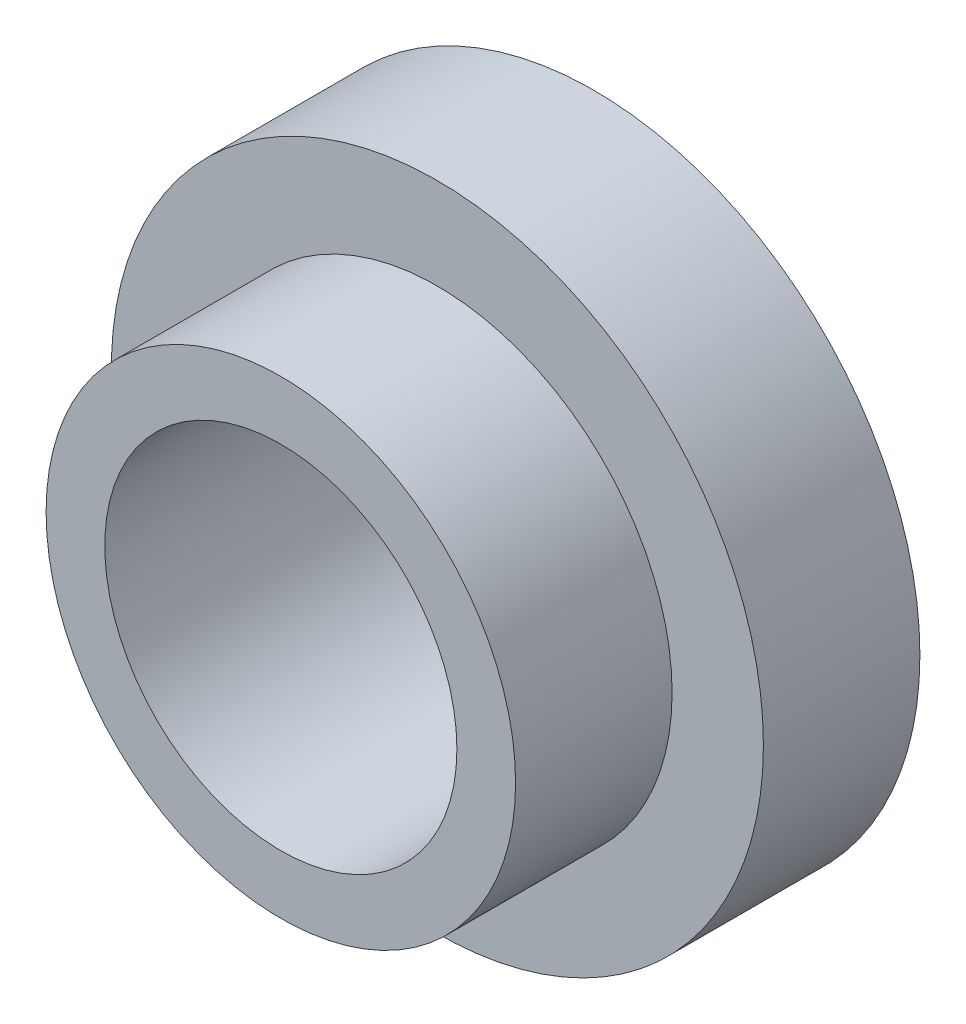
ISO-10303-21;
HEADER;
FILE_DESCRIPTION(('STEP AP214'),'2;1');
FILE_NAME('part.step','',(''),(''),'','','');
FILE_SCHEMA(('AUTOMOTIVE_DESIGN { 1 0 10303 214 1 1 1 1 }'));
ENDSEC;
DATA;
#1=APPLICATION_CONTEXT('core data for automotive mechanical design processes');
#2=APPLICATION_PROTOCOL_DEFINITION('international standard','automotive_design',2000,#1);
#3=PRODUCT_CONTEXT('',#1,'mechanical');
#4=PRODUCT('Part','Part','',(#3));
#5=PRODUCT_RELATED_PRODUCT_CATEGORY('part','',(#4));
#6=PRODUCT_DEFINITION_FORMATION('','',#4);
#7=PRODUCT_DEFINITION_CONTEXT('part definition',#1,'design');
#8=PRODUCT_DEFINITION('design','',#6,#7);
#9=PRODUCT_DEFINITION_SHAPE('','',#8);
#10=(LENGTH_UNIT() NAMED_UNIT(*) SI_UNIT(.MILLI.,.METRE.));
#11=(NAMED_UNIT(*) PLANE_ANGLE_UNIT() SI_UNIT($,.RADIAN.));
#12=(NAMED_UNIT(*) SI_UNIT($,.STERADIAN.) SOLID_ANGLE_UNIT());
#13=UNCERTAINTY_MEASURE_WITH_UNIT(LENGTH_MEASURE(1.E-05),#10,'distance_accuracy_value','');
#14=(GEOMETRIC_REPRESENTATION_CONTEXT(3) GLOBAL_UNCERTAINTY_ASSIGNED_CONTEXT((#13)) GLOBAL_UNIT_ASSIGNED_CONTEXT((#10,
#11,#12)) REPRESENTATION_CONTEXT('',''));
#15=CARTESIAN_POINT('',(0.,0.,0.));
#16=DIRECTION('',(0.,0.,1.));
#17=DIRECTION('',(1.,0.,0.));
#18=AXIS2_PLACEMENT_3D('',#15,#16,#17);
#19=CARTESIAN_POINT('',(0.,0.,4.));
#20=DIRECTION('',(0.,0.,1.));
#21=DIRECTION('',(1.,0.,0.));
#22=AXIS2_PLACEMENT_3D('',#19,#20,#21);
#23=PLANE('',#22);
#24=CARTESIAN_POINT('',(-9.52627944162862,5.49999999999963,4.));
#25=DIRECTION('',(0.,0.,1.));
#26=DIRECTION('',(1.,0.,0.));
#27=AXIS2_PLACEMENT_3D('',#24,#25,#26);
#28=CIRCLE('',#27,1.55);
#29=CARTESIAN_POINT('',(-7.97627944162862,5.49999999999963,4.));
#30=VERTEX_POINT('',#29);
#31=EDGE_CURVE('E83',#30,#30,#28,.T.);
#32=ORIENTED_EDGE('',*,*,#31,.F.);
#33=EDGE_LOOP('',(#32));
#34=FACE_BOUND('',#33,.T.);
#35=CARTESIAN_POINT('',(8.35628580991773E-13,-11.,4.));
#36=DIRECTION('',(0.,0.,1.));
#37=DIRECTION('',(1.,0.,0.));
#38=AXIS2_PLACEMENT_3D('',#35,#36,#37);
#39=CIRCLE('',#38,1.55);
#40=CARTESIAN_POINT('',(1.55000000000084,-11.,4.));
#41=VERTEX_POINT('',#40);
#42=EDGE_CURVE('E94',#41,#41,#39,.T.);
#43=ORIENTED_EDGE('',*,*,#42,.F.);
#44=EDGE_LOOP('',(#43));
#45=FACE_BOUND('',#44,.T.);
#46=CARTESIAN_POINT('',(9.52627944162903,5.50000000000037,4.));
#47=DIRECTION('',(0.,0.,1.));
#48=DIRECTION('',(1.,0.,0.));
#49=AXIS2_PLACEMENT_3D('',#46,#47,#48);
#50=CIRCLE('',#49,1.55);
#51=CARTESIAN_POINT('',(11.076279441629,5.50000000000037,4.));
#52=VERTEX_POINT('',#51);
#53=EDGE_CURVE('E107',#52,#52,#50,.T.);
#54=ORIENTED_EDGE('',*,*,#53,.F.);
#55=EDGE_LOOP('',(#54));
#56=FACE_BOUND('',#55,.T.);
#57=CARTESIAN_POINT('',(0.,0.,4.));
#58=DIRECTION('',(0.,0.,1.));
#59=DIRECTION('',(1.,0.,0.));
#60=AXIS2_PLACEMENT_3D('',#57,#58,#59);
#61=CIRCLE('',#60,5.5);
#62=CARTESIAN_POINT('',(5.5,0.,4.));
#63=VERTEX_POINT('',#62);
#64=EDGE_CURVE('E50',#63,#63,#61,.T.);
#65=ORIENTED_EDGE('',*,*,#64,.F.);
#66=EDGE_LOOP('',(#65));
#67=FACE_BOUND('',#66,.T.);
#68=CARTESIAN_POINT('',(0.,11.,4.));
#69=DIRECTION('',(0.,0.,1.));
#70=DIRECTION('',(1.,0.,0.));
#71=AXIS2_PLACEMENT_3D('',#68,#69,#70);
#72=CIRCLE('',#71,1.55);
#73=CARTESIAN_POINT('',(1.55,11.,4.));
#74=VERTEX_POINT('',#73);
#75=EDGE_CURVE('E111',#74,#74,#72,.T.);
#76=ORIENTED_EDGE('',*,*,#75,.F.);
#77=EDGE_LOOP('',(#76));
#78=FACE_BOUND('',#77,.T.);
#79=CARTESIAN_POINT('',(9.52627944162945,-5.49999999999964,4.));
#80=DIRECTION('',(0.,0.,1.));
#81=DIRECTION('',(1.,0.,0.));
#82=AXIS2_PLACEMENT_3D('',#79,#80,#81);
#83=CIRCLE('',#82,1.55);
#84=CARTESIAN_POINT('',(11.0762794416295,-5.49999999999964,4.));
#85=VERTEX_POINT('',#84);
#86=EDGE_CURVE('E103',#85,#85,#83,.T.);
#87=ORIENTED_EDGE('',*,*,#86,.F.);
#88=EDGE_LOOP('',(#87));
#89=FACE_BOUND('',#88,.T.);
#90=CARTESIAN_POINT('',(-9.5262794416282,-5.50000000000037,4.));
#91=DIRECTION('',(0.,0.,1.));
#92=DIRECTION('',(1.,0.,0.));
#93=AXIS2_PLACEMENT_3D('',#90,#91,#92);
#94=CIRCLE('',#93,1.55);
#95=CARTESIAN_POINT('',(-7.9762794416282,-5.50000000000037,4.));
#96=VERTEX_POINT('',#95);
#97=EDGE_CURVE('E88',#96,#96,#94,.T.);
#98=ORIENTED_EDGE('',*,*,#97,.F.);
#99=EDGE_LOOP('',(#98));
#100=FACE_BOUND('',#99,.T.);
#101=CARTESIAN_POINT('',(0.,0.,4.));
#102=DIRECTION('',(0.,0.,1.));
#103=DIRECTION('',(1.,0.,0.));
#104=AXIS2_PLACEMENT_3D('',#101,#102,#103);
#105=CIRCLE('',#104,13.5);
#106=CARTESIAN_POINT('',(13.5,0.,4.));
#107=VERTEX_POINT('',#106);
#108=EDGE_CURVE('E10',#107,#107,#105,.F.);
#109=ORIENTED_EDGE('',*,*,#108,.F.);
#110=EDGE_LOOP('',(#109));
#111=FACE_BOUND('',#110,.T.);
#112=ADVANCED_FACE('F37',(#34,#45,#56,#67,#78,#89,#100,#111),#23,.T.);
#113=CARTESIAN_POINT('',(0.,11.,4.));
#114=DIRECTION('',(0.,0.,-1.));
#115=DIRECTION('',(-1.,0.,0.));
#116=AXIS2_PLACEMENT_3D('',#113,#114,#115);
#117=CYLINDRICAL_SURFACE('',#116,1.55);
#118=ORIENTED_EDGE('',*,*,#75,.T.);
#119=EDGE_LOOP('',(#118));
#120=FACE_BOUND('',#119,.T.);
#121=CARTESIAN_POINT('',(0.,11.,2.8));
#122=DIRECTION('',(0.,0.,-1.));
#123=DIRECTION('',(-1.,0.,0.));
#124=AXIS2_PLACEMENT_3D('',#121,#122,#123);
#125=CIRCLE('',#124,1.55);
#126=CARTESIAN_POINT('',(-1.55,11.,2.8));
#127=VERTEX_POINT('',#126);
#128=EDGE_CURVE('E80',#127,#127,#125,.T.);
#129=ORIENTED_EDGE('',*,*,#128,.T.);
#130=EDGE_LOOP('',(#129));
#131=FACE_BOUND('',#130,.T.);
#132=ADVANCED_FACE('F137',(#120,#131),#117,.F.);
#133=CARTESIAN_POINT('',(9.52627944162903,5.50000000000037,4.));
#134=DIRECTION('',(0.,0.,-1.));
#135=DIRECTION('',(-1.,0.,0.));
#136=AXIS2_PLACEMENT_3D('',#133,#134,#135);
#137=CYLINDRICAL_SURFACE('',#136,1.55);
#138=ORIENTED_EDGE('',*,*,#53,.T.);
#139=EDGE_LOOP('',(#138));
#140=FACE_BOUND('',#139,.T.);
#141=CARTESIAN_POINT('',(9.52627944162903,5.50000000000037,2.8));
#142=DIRECTION('',(0.,0.,-1.));
#143=DIRECTION('',(-1.,0.,0.));
#144=AXIS2_PLACEMENT_3D('',#141,#142,#143);
#145=CIRCLE('',#144,1.55);
#146=CARTESIAN_POINT('',(7.97627944162903,5.50000000000037,2.8));
#147=VERTEX_POINT('',#146);
#148=EDGE_CURVE('E77',#147,#147,#145,.T.);
#149=ORIENTED_EDGE('',*,*,#148,.T.);
#150=EDGE_LOOP('',(#149));
#151=FACE_BOUND('',#150,.T.);
#152=ADVANCED_FACE('F142',(#140,#151),#137,.F.);
#153=CARTESIAN_POINT('',(9.52627944162945,-5.49999999999964,4.));
#154=DIRECTION('',(0.,0.,-1.));
#155=DIRECTION('',(-1.,0.,0.));
#156=AXIS2_PLACEMENT_3D('',#153,#154,#155);
#157=CYLINDRICAL_SURFACE('',#156,1.55);
#158=ORIENTED_EDGE('',*,*,#86,.T.);
#159=EDGE_LOOP('',(#158));
#160=FACE_BOUND('',#159,.T.);
#161=CARTESIAN_POINT('',(9.52627944162945,-5.49999999999964,2.8));
#162=DIRECTION('',(0.,0.,-1.));
#163=DIRECTION('',(-1.,0.,0.));
#164=AXIS2_PLACEMENT_3D('',#161,#162,#163);
#165=CIRCLE('',#164,1.55);
#166=CARTESIAN_POINT('',(7.97627944162945,-5.49999999999964,2.8));
#167=VERTEX_POINT('',#166);
#168=EDGE_CURVE('E73',#167,#167,#165,.T.);
#169=ORIENTED_EDGE('',*,*,#168,.T.);
#170=EDGE_LOOP('',(#169));
#171=FACE_BOUND('',#170,.T.);
#172=ADVANCED_FACE('F372',(#160,#171),#157,.F.);
#173=CARTESIAN_POINT('',(8.35628580991773E-13,-11.,4.));
#174=DIRECTION('',(0.,0.,-1.));
#175=DIRECTION('',(-1.,0.,0.));
#176=AXIS2_PLACEMENT_3D('',#173,#174,#175);
#177=CYLINDRICAL_SURFACE('',#176,1.55);
#178=ORIENTED_EDGE('',*,*,#42,.T.);
#179=EDGE_LOOP('',(#178));
#180=FACE_BOUND('',#179,.T.);
#181=CARTESIAN_POINT('',(8.35628580991773E-13,-11.,2.8));
#182=DIRECTION('',(0.,0.,-1.));
#183=DIRECTION('',(-1.,0.,0.));
#184=AXIS2_PLACEMENT_3D('',#181,#182,#183);
#185=CIRCLE('',#184,1.55);
#186=CARTESIAN_POINT('',(-1.54999999999916,-11.,2.8));
#187=VERTEX_POINT('',#186);
#188=EDGE_CURVE('E69',#187,#187,#185,.T.);
#189=ORIENTED_EDGE('',*,*,#188,.T.);
#190=EDGE_LOOP('',(#189));
#191=FACE_BOUND('',#190,.T.);
#192=ADVANCED_FACE('F368',(#180,#191),#177,.F.);
#193=CARTESIAN_POINT('',(-9.5262794416282,-5.50000000000037,4.));
#194=DIRECTION('',(0.,0.,-1.));
#195=DIRECTION('',(-1.,0.,0.));
#196=AXIS2_PLACEMENT_3D('',#193,#194,#195);
#197=CYLINDRICAL_SURFACE('',#196,1.55);
#198=ORIENTED_EDGE('',*,*,#97,.T.);
#199=EDGE_LOOP('',(#198));
#200=FACE_BOUND('',#199,.T.);
#201=CARTESIAN_POINT('',(-9.5262794416282,-5.50000000000037,2.8));
#202=DIRECTION('',(0.,0.,-1.));
#203=DIRECTION('',(-1.,0.,0.));
#204=AXIS2_PLACEMENT_3D('',#201,#202,#203);
#205=CIRCLE('',#204,1.55);
#206=CARTESIAN_POINT('',(-11.0762794416282,-5.50000000000037,2.8));
#207=VERTEX_POINT('',#206);
#208=EDGE_CURVE('E64',#207,#207,#205,.T.);
#209=ORIENTED_EDGE('',*,*,#208,.T.);
#210=EDGE_LOOP('',(#209));
#211=FACE_BOUND('',#210,.T.);
#212=ADVANCED_FACE('F150',(#200,#211),#197,.F.);
#213=CARTESIAN_POINT('',(-9.52627944162862,5.49999999999963,4.));
#214=DIRECTION('',(0.,0.,-1.));
#215=DIRECTION('',(-1.,0.,0.));
#216=AXIS2_PLACEMENT_3D('',#213,#214,#215);
#217=CYLINDRICAL_SURFACE('',#216,1.55);
#218=ORIENTED_EDGE('',*,*,#31,.T.);
#219=EDGE_LOOP('',(#218));
#220=FACE_BOUND('',#219,.T.);
#221=CARTESIAN_POINT('',(-9.52627944162862,5.49999999999963,2.8));
#222=DIRECTION('',(0.,0.,-1.));
#223=DIRECTION('',(-1.,0.,0.));
#224=AXIS2_PLACEMENT_3D('',#221,#222,#223);
#225=CIRCLE('',#224,1.55);
#226=CARTESIAN_POINT('',(-11.0762794416286,5.49999999999963,2.8));
#227=VERTEX_POINT('',#226);
#228=EDGE_CURVE('E60',#227,#227,#225,.T.);
#229=ORIENTED_EDGE('',*,*,#228,.T.);
#230=EDGE_LOOP('',(#229));
#231=FACE_BOUND('',#230,.T.);
#232=ADVANCED_FACE('F145',(#220,#231),#217,.F.);
#233=CARTESIAN_POINT('',(0.,0.,0.));
#234=DIRECTION('',(0.,0.,1.));
#235=DIRECTION('',(1.,0.,0.));
#236=AXIS2_PLACEMENT_3D('',#233,#234,#235);
#237=PLANE('',#236);
#238=CARTESIAN_POINT('',(0.,18.,0.));
#239=DIRECTION('',(0.,0.,-1.));
#240=DIRECTION('',(-1.,0.,0.));
#241=AXIS2_PLACEMENT_3D('',#238,#239,#240);
#242=CIRCLE('',#241,2.5);
#243=CARTESIAN_POINT('',(-2.5,18.,0.));
#244=VERTEX_POINT('',#243);
#245=EDGE_CURVE('E155',#244,#244,#242,.T.);
#246=ORIENTED_EDGE('',*,*,#245,.F.);
#247=EDGE_LOOP('',(#246));
#248=FACE_BOUND('',#247,.T.);
#249=CARTESIAN_POINT('',(-18.0000000000005,5.08284223389574E-13,0.));
#250=DIRECTION('',(0.,0.,-1.));
#251=DIRECTION('',(-1.,0.,0.));
#252=AXIS2_PLACEMENT_3D('',#249,#250,#251);
#253=CIRCLE('',#252,2.5000000000004);
#254=CARTESIAN_POINT('',(-20.5000000000009,5.08284223389574E-13,0.));
#255=VERTEX_POINT('',#254);
#256=EDGE_CURVE('E159',#255,#255,#253,.T.);
#257=ORIENTED_EDGE('',*,*,#256,.F.);
#258=EDGE_LOOP('',(#257));
#259=FACE_BOUND('',#258,.T.);
#260=CARTESIAN_POINT('',(-1.01656844677915E-12,-18.,0.));
#261=DIRECTION('',(0.,0.,-1.));
#262=DIRECTION('',(-1.,0.,0.));
#263=AXIS2_PLACEMENT_3D('',#260,#261,#262);
#264=CIRCLE('',#263,2.50000000000109);
#265=CARTESIAN_POINT('',(-2.50000000000211,-18.,0.));
#266=VERTEX_POINT('',#265);
#267=EDGE_CURVE('E163',#266,#266,#264,.T.);
#268=ORIENTED_EDGE('',*,*,#267,.F.);
#269=EDGE_LOOP('',(#268));
#270=FACE_BOUND('',#269,.T.);
#271=CARTESIAN_POINT('',(17.9999999999995,-5.10488587628039E-13,0.));
#272=DIRECTION('',(0.,0.,-1.));
#273=DIRECTION('',(-1.,0.,0.));
#274=AXIS2_PLACEMENT_3D('',#271,#272,#273);
#275=CIRCLE('',#274,2.50000000000082);
#276=CARTESIAN_POINT('',(15.4999999999987,-5.10488587628039E-13,0.));
#277=VERTEX_POINT('',#276);
#278=EDGE_CURVE('E167',#277,#277,#275,.T.);
#279=ORIENTED_EDGE('',*,*,#278,.F.);
#280=EDGE_LOOP('',(#279));
#281=FACE_BOUND('',#280,.T.);
#282=CARTESIAN_POINT('',(-9.52627944162882,5.5,0.));
#283=DIRECTION('',(0.,0.,-1.));
#284=DIRECTION('',(-1.,0.,0.));
#285=AXIS2_PLACEMENT_3D('',#282,#283,#284);
#286=CIRCLE('',#285,2.8);
#287=CARTESIAN_POINT('',(-12.3262794416288,5.5,0.));
#288=VERTEX_POINT('',#287);
#289=EDGE_CURVE('E171',#288,#288,#286,.T.);
#290=ORIENTED_EDGE('',*,*,#289,.F.);
#291=EDGE_LOOP('',(#290));
#292=FACE_BOUND('',#291,.T.);
#293=CARTESIAN_POINT('',(-9.52627944162883,-5.5,0.));
#294=DIRECTION('',(0.,0.,-1.));
#295=DIRECTION('',(-1.,0.,0.));
#296=AXIS2_PLACEMENT_3D('',#293,#294,#295);
#297=CIRCLE('',#296,2.8);
#298=CARTESIAN_POINT('',(-12.3262794416288,-5.5,0.));
#299=VERTEX_POINT('',#298);
#300=EDGE_CURVE('E175',#299,#299,#297,.T.);
#301=ORIENTED_EDGE('',*,*,#300,.F.);
#302=EDGE_LOOP('',(#301));
#303=FACE_BOUND('',#302,.T.);
#304=CARTESIAN_POINT('',(0.,-11.,0.));
#305=DIRECTION('',(0.,0.,-1.));
#306=DIRECTION('',(-1.,0.,0.));
#307=AXIS2_PLACEMENT_3D('',#304,#305,#306);
#308=CIRCLE('',#307,2.8);
#309=CARTESIAN_POINT('',(-2.8,-11.,0.));
#310=VERTEX_POINT('',#309);
#311=EDGE_CURVE('E179',#310,#310,#308,.T.);
#312=ORIENTED_EDGE('',*,*,#311,.F.);
#313=EDGE_LOOP('',(#312));
#314=FACE_BOUND('',#313,.T.);
#315=CARTESIAN_POINT('',(9.52627944162882,-5.50000000000001,0.));
#316=DIRECTION('',(0.,0.,-1.));
#317=DIRECTION('',(-1.,0.,0.));
#318=AXIS2_PLACEMENT_3D('',#315,#316,#317);
#319=CIRCLE('',#318,2.8);
#320=CARTESIAN_POINT('',(6.72627944162882,-5.50000000000001,0.));
#321=VERTEX_POINT('',#320);
#322=EDGE_CURVE('E183',#321,#321,#319,.T.);
#323=ORIENTED_EDGE('',*,*,#322,.F.);
#324=EDGE_LOOP('',(#323));
#325=FACE_BOUND('',#324,.T.);
#326=CARTESIAN_POINT('',(9.52627944162883,5.49999999999999,0.));
#327=DIRECTION('',(0.,0.,-1.));
#328=DIRECTION('',(-1.,0.,0.));
#329=AXIS2_PLACEMENT_3D('',#326,#327,#328);
#330=CIRCLE('',#329,2.8);
#331=CARTESIAN_POINT('',(6.72627944162883,5.49999999999999,0.));
#332=VERTEX_POINT('',#331);
#333=EDGE_CURVE('E187',#332,#332,#330,.T.);
#334=ORIENTED_EDGE('',*,*,#333,.F.);
#335=EDGE_LOOP('',(#334));
#336=FACE_BOUND('',#335,.T.);
#337=CARTESIAN_POINT('',(0.,11.,0.));
#338=DIRECTION('',(0.,0.,-1.));
#339=DIRECTION('',(-1.,0.,0.));
#340=AXIS2_PLACEMENT_3D('',#337,#338,#339);
#341=CIRCLE('',#340,2.8);
#342=CARTESIAN_POINT('',(-2.8,11.,0.));
#343=VERTEX_POINT('',#342);
#344=EDGE_CURVE('E97',#343,#343,#341,.T.);
#345=ORIENTED_EDGE('',*,*,#344,.F.);
#346=EDGE_LOOP('',(#345));
#347=FACE_BOUND('',#346,.T.);
#348=CARTESIAN_POINT('',(0.,0.,0.));
#349=DIRECTION('',(0.,0.,1.));
#350=DIRECTION('',(1.,0.,0.));
#351=AXIS2_PLACEMENT_3D('',#348,#349,#350);
#352=CIRCLE('',#351,25.);
#353=CARTESIAN_POINT('',(25.,0.,0.));
#354=VERTEX_POINT('',#353);
#355=EDGE_CURVE('E45',#354,#354,#352,.T.);
#356=ORIENTED_EDGE('',*,*,#355,.F.);
#357=EDGE_LOOP('',(#356));
#358=FACE_BOUND('',#357,.T.);
#359=CARTESIAN_POINT('',(0.,0.,0.));
#360=DIRECTION('',(0.,0.,1.));
#361=DIRECTION('',(1.,0.,0.));
#362=AXIS2_PLACEMENT_3D('',#359,#360,#361);
#363=CIRCLE('',#362,5.5);
#364=CARTESIAN_POINT('',(5.5,0.,0.));
#365=VERTEX_POINT('',#364);
#366=EDGE_CURVE('E56',#365,#365,#363,.T.);
#367=ORIENTED_EDGE('',*,*,#366,.T.);
#368=EDGE_LOOP('',(#367));
#369=FACE_BOUND('',#368,.T.);
#370=ADVANCED_FACE('F120',(#248,#259,#270,#281,#292,#303,#314,#325,#336,#347,#358,#369),#237,.F.);
#371=CARTESIAN_POINT('',(0.,0.,4.));
#372=DIRECTION('',(0.,0.,-1.));
#373=DIRECTION('',(-1.,0.,0.));
#374=AXIS2_PLACEMENT_3D('',#371,#372,#373);
#375=CYLINDRICAL_SURFACE('',#374,25.);
#376=ORIENTED_EDGE('',*,*,#355,.T.);
#377=EDGE_LOOP('',(#376));
#378=FACE_BOUND('',#377,.T.);
#379=CARTESIAN_POINT('',(0.,0.,12.));
#380=DIRECTION('',(0.,0.,1.));
#381=DIRECTION('',(1.,0.,0.));
#382=AXIS2_PLACEMENT_3D('',#379,#380,#381);
#383=CIRCLE('',#382,25.);
#384=CARTESIAN_POINT('',(25.,0.,12.));
#385=VERTEX_POINT('',#384);
#386=EDGE_CURVE('E239',#385,#385,#383,.T.);
#387=ORIENTED_EDGE('',*,*,#386,.F.);
#388=EDGE_LOOP('',(#387));
#389=FACE_BOUND('',#388,.T.);
#390=ADVANCED_FACE('F39',(#378,#389),#375,.T.);
#391=CARTESIAN_POINT('',(0.,0.,4.));
#392=DIRECTION('',(0.,0.,-1.));
#393=DIRECTION('',(-1.,0.,0.));
#394=AXIS2_PLACEMENT_3D('',#391,#392,#393);
#395=CYLINDRICAL_SURFACE('',#394,5.5);
#396=ORIENTED_EDGE('',*,*,#64,.T.);
#397=EDGE_LOOP('',(#396));
#398=FACE_BOUND('',#397,.T.);
#399=ORIENTED_EDGE('',*,*,#366,.F.);
#400=EDGE_LOOP('',(#399));
#401=FACE_BOUND('',#400,.T.);
#402=ADVANCED_FACE('F122',(#398,#401),#395,.F.);
#403=CARTESIAN_POINT('',(-9.52627944162882,5.5,2.8));
#404=DIRECTION('',(0.,0.,-1.));
#405=DIRECTION('',(-1.,0.,0.));
#406=AXIS2_PLACEMENT_3D('',#403,#404,#405);
#407=CYLINDRICAL_SURFACE('',#406,2.8);
#408=CARTESIAN_POINT('',(-9.52627944162882,5.5,2.8));
#409=DIRECTION('',(0.,0.,-1.));
#410=DIRECTION('',(-1.,0.,0.));
#411=AXIS2_PLACEMENT_3D('',#408,#409,#410);
#412=CIRCLE('',#411,2.8);
#413=CARTESIAN_POINT('',(-12.3262794416288,5.5,2.8));
#414=VERTEX_POINT('',#413);
#415=EDGE_CURVE('E193',#414,#414,#412,.T.);
#416=ORIENTED_EDGE('',*,*,#415,.F.);
#417=EDGE_LOOP('',(#416));
#418=FACE_BOUND('',#417,.T.);
#419=ORIENTED_EDGE('',*,*,#289,.T.);
#420=EDGE_LOOP('',(#419));
#421=FACE_BOUND('',#420,.T.);
#422=ADVANCED_FACE('F124',(#418,#421),#407,.F.);
#423=CARTESIAN_POINT('',(-9.52627944162882,5.5,2.8));
#424=DIRECTION('',(0.,0.,-1.));
#425=DIRECTION('',(-1.,0.,0.));
#426=AXIS2_PLACEMENT_3D('',#423,#424,#425);
#427=PLANE('',#426);
#428=ORIENTED_EDGE('',*,*,#228,.F.);
#429=EDGE_LOOP('',(#428));
#430=FACE_BOUND('',#429,.T.);
#431=ORIENTED_EDGE('',*,*,#415,.T.);
#432=EDGE_LOOP('',(#431));
#433=FACE_BOUND('',#432,.T.);
#434=ADVANCED_FACE('F131',(#430,#433),#427,.T.);
#435=CARTESIAN_POINT('',(-9.52627944162883,-5.5,2.8));
#436=DIRECTION('',(0.,0.,-1.));
#437=DIRECTION('',(-1.,0.,0.));
#438=AXIS2_PLACEMENT_3D('',#435,#436,#437);
#439=CYLINDRICAL_SURFACE('',#438,2.8);
#440=CARTESIAN_POINT('',(-9.52627944162883,-5.5,2.8));
#441=DIRECTION('',(0.,0.,-1.));
#442=DIRECTION('',(-1.,0.,0.));
#443=AXIS2_PLACEMENT_3D('',#440,#441,#442);
#444=CIRCLE('',#443,2.8);
#445=CARTESIAN_POINT('',(-12.3262794416288,-5.5,2.8));
#446=VERTEX_POINT('',#445);
#447=EDGE_CURVE('E202',#446,#446,#444,.T.);
#448=ORIENTED_EDGE('',*,*,#447,.F.);
#449=EDGE_LOOP('',(#448));
#450=FACE_BOUND('',#449,.T.);
#451=ORIENTED_EDGE('',*,*,#300,.T.);
#452=EDGE_LOOP('',(#451));
#453=FACE_BOUND('',#452,.T.);
#454=ADVANCED_FACE('F335',(#450,#453),#439,.F.);
#455=CARTESIAN_POINT('',(-9.52627944162883,-5.5,2.8));
#456=DIRECTION('',(0.,0.,-1.));
#457=DIRECTION('',(-1.,0.,0.));
#458=AXIS2_PLACEMENT_3D('',#455,#456,#457);
#459=PLANE('',#458);
#460=ORIENTED_EDGE('',*,*,#208,.F.);
#461=EDGE_LOOP('',(#460));
#462=FACE_BOUND('',#461,.T.);
#463=ORIENTED_EDGE('',*,*,#447,.T.);
#464=EDGE_LOOP('',(#463));
#465=FACE_BOUND('',#464,.T.);
#466=ADVANCED_FACE('F338',(#462,#465),#459,.T.);
#467=CARTESIAN_POINT('',(0.,-11.,2.8));
#468=DIRECTION('',(0.,0.,-1.));
#469=DIRECTION('',(-1.,0.,0.));
#470=AXIS2_PLACEMENT_3D('',#467,#468,#469);
#471=CYLINDRICAL_SURFACE('',#470,2.8);
#472=CARTESIAN_POINT('',(0.,-11.,2.8));
#473=DIRECTION('',(0.,0.,-1.));
#474=DIRECTION('',(-1.,0.,0.));
#475=AXIS2_PLACEMENT_3D('',#472,#473,#474);
#476=CIRCLE('',#475,2.8);
#477=CARTESIAN_POINT('',(-2.8,-11.,2.8));
#478=VERTEX_POINT('',#477);
#479=EDGE_CURVE('E212',#478,#478,#476,.T.);
#480=ORIENTED_EDGE('',*,*,#479,.F.);
#481=EDGE_LOOP('',(#480));
#482=FACE_BOUND('',#481,.T.);
#483=ORIENTED_EDGE('',*,*,#311,.T.);
#484=EDGE_LOOP('',(#483));
#485=FACE_BOUND('',#484,.T.);
#486=ADVANCED_FACE('F341',(#482,#485),#471,.F.);
#487=CARTESIAN_POINT('',(0.,-11.,2.8));
#488=DIRECTION('',(0.,0.,-1.));
#489=DIRECTION('',(-1.,0.,0.));
#490=AXIS2_PLACEMENT_3D('',#487,#488,#489);
#491=PLANE('',#490);
#492=ORIENTED_EDGE('',*,*,#188,.F.);
#493=EDGE_LOOP('',(#492));
#494=FACE_BOUND('',#493,.T.);
#495=ORIENTED_EDGE('',*,*,#479,.T.);
#496=EDGE_LOOP('',(#495));
#497=FACE_BOUND('',#496,.T.);
#498=ADVANCED_FACE('F346',(#494,#497),#491,.T.);
#499=CARTESIAN_POINT('',(9.52627944162882,-5.50000000000001,2.8));
#500=DIRECTION('',(0.,0.,-1.));
#501=DIRECTION('',(-1.,0.,0.));
#502=AXIS2_PLACEMENT_3D('',#499,#500,#501);
#503=CYLINDRICAL_SURFACE('',#502,2.8);
#504=CARTESIAN_POINT('',(9.52627944162882,-5.50000000000001,2.8));
#505=DIRECTION('',(0.,0.,-1.));
#506=DIRECTION('',(-1.,0.,0.));
#507=AXIS2_PLACEMENT_3D('',#504,#505,#506);
#508=CIRCLE('',#507,2.8);
#509=CARTESIAN_POINT('',(6.72627944162882,-5.50000000000001,2.8));
#510=VERTEX_POINT('',#509);
#511=EDGE_CURVE('E218',#510,#510,#508,.T.);
#512=ORIENTED_EDGE('',*,*,#511,.F.);
#513=EDGE_LOOP('',(#512));
#514=FACE_BOUND('',#513,.T.);
#515=ORIENTED_EDGE('',*,*,#322,.T.);
#516=EDGE_LOOP('',(#515));
#517=FACE_BOUND('',#516,.T.);
#518=ADVANCED_FACE('F349',(#514,#517),#503,.F.);
#519=CARTESIAN_POINT('',(9.52627944162882,-5.50000000000001,2.8));
#520=DIRECTION('',(0.,0.,-1.));
#521=DIRECTION('',(-1.,0.,0.));
#522=AXIS2_PLACEMENT_3D('',#519,#520,#521);
#523=PLANE('',#522);
#524=ORIENTED_EDGE('',*,*,#168,.F.);
#525=EDGE_LOOP('',(#524));
#526=FACE_BOUND('',#525,.T.);
#527=ORIENTED_EDGE('',*,*,#511,.T.);
#528=EDGE_LOOP('',(#527));
#529=FACE_BOUND('',#528,.T.);
#530=ADVANCED_FACE('F332',(#526,#529),#523,.T.);
#531=CARTESIAN_POINT('',(9.52627944162883,5.49999999999999,2.8));
#532=DIRECTION('',(0.,0.,-1.));
#533=DIRECTION('',(-1.,0.,0.));
#534=AXIS2_PLACEMENT_3D('',#531,#532,#533);
#535=CYLINDRICAL_SURFACE('',#534,2.8);
#536=CARTESIAN_POINT('',(9.52627944162883,5.49999999999999,2.8));
#537=DIRECTION('',(0.,0.,-1.));
#538=DIRECTION('',(-1.,0.,0.));
#539=AXIS2_PLACEMENT_3D('',#536,#537,#538);
#540=CIRCLE('',#539,2.8);
#541=CARTESIAN_POINT('',(6.72627944162883,5.49999999999999,2.8));
#542=VERTEX_POINT('',#541);
#543=EDGE_CURVE('E223',#542,#542,#540,.T.);
#544=ORIENTED_EDGE('',*,*,#543,.F.);
#545=EDGE_LOOP('',(#544));
#546=FACE_BOUND('',#545,.T.);
#547=ORIENTED_EDGE('',*,*,#333,.T.);
#548=EDGE_LOOP('',(#547));
#549=FACE_BOUND('',#548,.T.);
#550=ADVANCED_FACE('F328',(#546,#549),#535,.F.);
#551=CARTESIAN_POINT('',(9.52627944162883,5.49999999999999,2.8));
#552=DIRECTION('',(0.,0.,-1.));
#553=DIRECTION('',(-1.,0.,0.));
#554=AXIS2_PLACEMENT_3D('',#551,#552,#553);
#555=PLANE('',#554);
#556=ORIENTED_EDGE('',*,*,#148,.F.);
#557=EDGE_LOOP('',(#556));
#558=FACE_BOUND('',#557,.T.);
#559=ORIENTED_EDGE('',*,*,#543,.T.);
#560=EDGE_LOOP('',(#559));
#561=FACE_BOUND('',#560,.T.);
#562=ADVANCED_FACE('F324',(#558,#561),#555,.T.);
#563=CARTESIAN_POINT('',(0.,11.,2.8));
#564=DIRECTION('',(0.,0.,-1.));
#565=DIRECTION('',(-1.,0.,0.));
#566=AXIS2_PLACEMENT_3D('',#563,#564,#565);
#567=CYLINDRICAL_SURFACE('',#566,2.8);
#568=CARTESIAN_POINT('',(0.,11.,2.8));
#569=DIRECTION('',(0.,0.,-1.));
#570=DIRECTION('',(-1.,0.,0.));
#571=AXIS2_PLACEMENT_3D('',#568,#569,#570);
#572=CIRCLE('',#571,2.8);
#573=CARTESIAN_POINT('',(-2.8,11.,2.8));
#574=VERTEX_POINT('',#573);
#575=EDGE_CURVE('E65',#574,#574,#572,.T.);
#576=ORIENTED_EDGE('',*,*,#575,.F.);
#577=EDGE_LOOP('',(#576));
#578=FACE_BOUND('',#577,.T.);
#579=ORIENTED_EDGE('',*,*,#344,.T.);
#580=EDGE_LOOP('',(#579));
#581=FACE_BOUND('',#580,.T.);
#582=ADVANCED_FACE('F327',(#578,#581),#567,.F.);
#583=CARTESIAN_POINT('',(0.,11.,2.8));
#584=DIRECTION('',(0.,0.,-1.));
#585=DIRECTION('',(-1.,0.,0.));
#586=AXIS2_PLACEMENT_3D('',#583,#584,#585);
#587=PLANE('',#586);
#588=ORIENTED_EDGE('',*,*,#128,.F.);
#589=EDGE_LOOP('',(#588));
#590=FACE_BOUND('',#589,.T.);
#591=ORIENTED_EDGE('',*,*,#575,.T.);
#592=EDGE_LOOP('',(#591));
#593=FACE_BOUND('',#592,.T.);
#594=ADVANCED_FACE('F319',(#590,#593),#587,.T.);
#595=CARTESIAN_POINT('',(0.,0.,24.));
#596=DIRECTION('',(0.,0.,1.));
#597=DIRECTION('',(1.,0.,0.));
#598=AXIS2_PLACEMENT_3D('',#595,#596,#597);
#599=PLANE('',#598);
#600=CARTESIAN_POINT('',(0.,0.,24.));
#601=DIRECTION('',(0.,0.,1.));
#602=DIRECTION('',(1.,0.,0.));
#603=AXIS2_PLACEMENT_3D('',#600,#601,#602);
#604=CIRCLE('',#603,18.);
#605=CARTESIAN_POINT('',(18.,0.,24.));
#606=VERTEX_POINT('',#605);
#607=EDGE_CURVE('E230',#606,#606,#604,.T.);
#608=ORIENTED_EDGE('',*,*,#607,.T.);
#609=EDGE_LOOP('',(#608));
#610=FACE_BOUND('',#609,.T.);
#611=CARTESIAN_POINT('',(0.,0.,24.));
#612=DIRECTION('',(0.,0.,1.));
#613=DIRECTION('',(1.,0.,0.));
#614=AXIS2_PLACEMENT_3D('',#611,#612,#613);
#615=CIRCLE('',#614,13.5);
#616=CARTESIAN_POINT('',(13.5,0.,24.));
#617=VERTEX_POINT('',#616);
#618=EDGE_CURVE('E235',#617,#617,#615,.T.);
#619=ORIENTED_EDGE('',*,*,#618,.F.);
#620=EDGE_LOOP('',(#619));
#621=FACE_BOUND('',#620,.T.);
#622=ADVANCED_FACE('F316',(#610,#621),#599,.T.);
#623=CARTESIAN_POINT('',(0.,0.,24.));
#624=DIRECTION('',(0.,0.,-1.));
#625=DIRECTION('',(-1.,0.,0.));
#626=AXIS2_PLACEMENT_3D('',#623,#624,#625);
#627=CYLINDRICAL_SURFACE('',#626,18.);
#628=CARTESIAN_POINT('',(0.,0.,12.));
#629=DIRECTION('',(0.,0.,1.));
#630=DIRECTION('',(1.,0.,0.));
#631=AXIS2_PLACEMENT_3D('',#628,#629,#630);
#632=CIRCLE('',#631,18.);
#633=CARTESIAN_POINT('',(18.,0.,12.));
#634=VERTEX_POINT('',#633);
#635=EDGE_CURVE('E243',#634,#634,#632,.T.);
#636=ORIENTED_EDGE('',*,*,#635,.T.);
#637=EDGE_LOOP('',(#636));
#638=FACE_BOUND('',#637,.T.);
#639=ORIENTED_EDGE('',*,*,#607,.F.);
#640=EDGE_LOOP('',(#639));
#641=FACE_BOUND('',#640,.T.);
#642=ADVANCED_FACE('F314',(#638,#641),#627,.T.);
#643=CARTESIAN_POINT('',(0.,0.,24.));
#644=DIRECTION('',(0.,0.,-1.));
#645=DIRECTION('',(-1.,0.,0.));
#646=AXIS2_PLACEMENT_3D('',#643,#644,#645);
#647=CYLINDRICAL_SURFACE('',#646,13.5);
#648=ORIENTED_EDGE('',*,*,#618,.T.);
#649=EDGE_LOOP('',(#648));
#650=FACE_BOUND('',#649,.T.);
#651=ORIENTED_EDGE('',*,*,#108,.T.);
#652=EDGE_LOOP('',(#651));
#653=FACE_BOUND('',#652,.T.);
#654=ADVANCED_FACE('F310',(#650,#653),#647,.F.);
#655=CARTESIAN_POINT('',(0.,0.,12.));
#656=DIRECTION('',(0.,0.,1.));
#657=DIRECTION('',(1.,0.,0.));
#658=AXIS2_PLACEMENT_3D('',#655,#656,#657);
#659=PLANE('',#658);
#660=ORIENTED_EDGE('',*,*,#386,.T.);
#661=EDGE_LOOP('',(#660));
#662=FACE_BOUND('',#661,.T.);
#663=ORIENTED_EDGE('',*,*,#635,.F.);
#664=EDGE_LOOP('',(#663));
#665=FACE_BOUND('',#664,.T.);
#666=ADVANCED_FACE('F306',(#662,#665),#659,.T.);
#667=CARTESIAN_POINT('',(17.9999999999995,-5.10488587628039E-13,8.));
#668=DIRECTION('',(0.,0.,-1.));
#669=DIRECTION('',(-1.,0.,0.));
#670=AXIS2_PLACEMENT_3D('',#667,#668,#669);
#671=CYLINDRICAL_SURFACE('',#670,2.50000000000082);
#672=CARTESIAN_POINT('',(17.9999999999995,-5.10488587628039E-13,8.));
#673=DIRECTION('',(0.,0.,-1.));
#674=DIRECTION('',(-1.,0.,0.));
#675=AXIS2_PLACEMENT_3D('',#672,#673,#674);
#676=CIRCLE('',#675,2.50000000000082);
#677=CARTESIAN_POINT('',(15.4999999999987,-5.10488587628039E-13,8.));
#678=VERTEX_POINT('',#677);
#679=EDGE_CURVE('E250',#678,#678,#676,.T.);
#680=ORIENTED_EDGE('',*,*,#679,.F.);
#681=EDGE_LOOP('',(#680));
#682=FACE_BOUND('',#681,.T.);
#683=ORIENTED_EDGE('',*,*,#278,.T.);
#684=EDGE_LOOP('',(#683));
#685=FACE_BOUND('',#684,.T.);
#686=ADVANCED_FACE('F302',(#682,#685),#671,.F.);
#687=CARTESIAN_POINT('',(17.9999999999995,-5.10488587628039E-13,8.));
#688=DIRECTION('',(0.,0.,-1.));
#689=DIRECTION('',(-1.,0.,0.));
#690=AXIS2_PLACEMENT_3D('',#687,#688,#689);
#691=PLANE('',#690);
#692=ORIENTED_EDGE('',*,*,#679,.T.);
#693=EDGE_LOOP('',(#692));
#694=FACE_BOUND('',#693,.T.);
#695=ADVANCED_FACE('F298',(#694),#691,.T.);
#696=CARTESIAN_POINT('',(-1.01656844677915E-12,-18.,8.));
#697=DIRECTION('',(0.,0.,-1.));
#698=DIRECTION('',(-1.,0.,0.));
#699=AXIS2_PLACEMENT_3D('',#696,#697,#698);
#700=CYLINDRICAL_SURFACE('',#699,2.50000000000109);
#701=CARTESIAN_POINT('',(-1.01656844677915E-12,-18.,8.));
#702=DIRECTION('',(0.,0.,-1.));
#703=DIRECTION('',(-1.,0.,0.));
#704=AXIS2_PLACEMENT_3D('',#701,#702,#703);
#705=CIRCLE('',#704,2.50000000000109);
#706=CARTESIAN_POINT('',(-2.50000000000211,-18.,8.));
#707=VERTEX_POINT('',#706);
#708=EDGE_CURVE('E256',#707,#707,#705,.T.);
#709=ORIENTED_EDGE('',*,*,#708,.F.);
#710=EDGE_LOOP('',(#709));
#711=FACE_BOUND('',#710,.T.);
#712=ORIENTED_EDGE('',*,*,#267,.T.);
#713=EDGE_LOOP('',(#712));
#714=FACE_BOUND('',#713,.T.);
#715=ADVANCED_FACE('F294',(#711,#714),#700,.F.);
#716=CARTESIAN_POINT('',(-1.01656844677915E-12,-18.,8.));
#717=DIRECTION('',(0.,0.,-1.));
#718=DIRECTION('',(-1.,0.,0.));
#719=AXIS2_PLACEMENT_3D('',#716,#717,#718);
#720=PLANE('',#719);
#721=ORIENTED_EDGE('',*,*,#708,.T.);
#722=EDGE_LOOP('',(#721));
#723=FACE_BOUND('',#722,.T.);
#724=ADVANCED_FACE('F290',(#723),#720,.T.);
#725=CARTESIAN_POINT('',(-18.0000000000005,5.08284223389574E-13,8.));
#726=DIRECTION('',(0.,0.,-1.));
#727=DIRECTION('',(-1.,0.,0.));
#728=AXIS2_PLACEMENT_3D('',#725,#726,#727);
#729=CYLINDRICAL_SURFACE('',#728,2.5000000000004);
#730=CARTESIAN_POINT('',(-18.0000000000005,5.08284223389574E-13,8.));
#731=DIRECTION('',(0.,0.,-1.));
#732=DIRECTION('',(-1.,0.,0.));
#733=AXIS2_PLACEMENT_3D('',#730,#731,#732);
#734=CIRCLE('',#733,2.5000000000004);
#735=CARTESIAN_POINT('',(-20.5000000000009,5.08284223389574E-13,8.));
#736=VERTEX_POINT('',#735);
#737=EDGE_CURVE('E262',#736,#736,#734,.T.);
#738=ORIENTED_EDGE('',*,*,#737,.F.);
#739=EDGE_LOOP('',(#738));
#740=FACE_BOUND('',#739,.T.);
#741=ORIENTED_EDGE('',*,*,#256,.T.);
#742=EDGE_LOOP('',(#741));
#743=FACE_BOUND('',#742,.T.);
#744=ADVANCED_FACE('F284',(#740,#743),#729,.F.);
#745=CARTESIAN_POINT('',(-18.0000000000005,5.08284223389574E-13,8.));
#746=DIRECTION('',(0.,0.,-1.));
#747=DIRECTION('',(-1.,0.,0.));
#748=AXIS2_PLACEMENT_3D('',#745,#746,#747);
#749=PLANE('',#748);
#750=ORIENTED_EDGE('',*,*,#737,.T.);
#751=EDGE_LOOP('',(#750));
#752=FACE_BOUND('',#751,.T.);
#753=ADVANCED_FACE('F277',(#752),#749,.T.);
#754=CARTESIAN_POINT('',(0.,18.,8.));
#755=DIRECTION('',(0.,0.,-1.));
#756=DIRECTION('',(-1.,0.,0.));
#757=AXIS2_PLACEMENT_3D('',#754,#755,#756);
#758=CYLINDRICAL_SURFACE('',#757,2.5);
#759=CARTESIAN_POINT('',(0.,18.,8.));
#760=DIRECTION('',(0.,0.,-1.));
#761=DIRECTION('',(-1.,0.,0.));
#762=AXIS2_PLACEMENT_3D('',#759,#760,#761);
#763=CIRCLE('',#762,2.5);
#764=CARTESIAN_POINT('',(-2.5,18.,8.));
#765=VERTEX_POINT('',#764);
#766=EDGE_CURVE('E247',#765,#765,#763,.T.);
#767=ORIENTED_EDGE('',*,*,#766,.F.);
#768=EDGE_LOOP('',(#767));
#769=FACE_BOUND('',#768,.T.);
#770=ORIENTED_EDGE('',*,*,#245,.T.);
#771=EDGE_LOOP('',(#770));
#772=FACE_BOUND('',#771,.T.);
#773=ADVANCED_FACE('F274',(#769,#772),#758,.F.);
#774=CARTESIAN_POINT('',(0.,18.,8.));
#775=DIRECTION('',(0.,0.,-1.));
#776=DIRECTION('',(-1.,0.,0.));
#777=AXIS2_PLACEMENT_3D('',#774,#775,#776);
#778=PLANE('',#777);
#779=ORIENTED_EDGE('',*,*,#766,.T.);
#780=EDGE_LOOP('',(#779));
#781=FACE_BOUND('',#780,.T.);
#782=ADVANCED_FACE('F272',(#781),#778,.T.);
#783=CLOSED_SHELL('',(#112,#132,#152,#172,#192,#212,#232,#370,#390,#402,#422,#434,#454,#466,
#486,#498,#518,#530,#550,#562,#582,#594,#622,#642,#654,#666,#686,#695,#715,#724,#744,#753,#773,#782));
#784=MANIFOLD_SOLID_BREP('B2',#783);
#785=ADVANCED_BREP_SHAPE_REPRESENTATION('',(#18,#784),#14);
#786=SHAPE_DEFINITION_REPRESENTATION(#9,#785);
ENDSEC;
END-ISO-10303-21;
